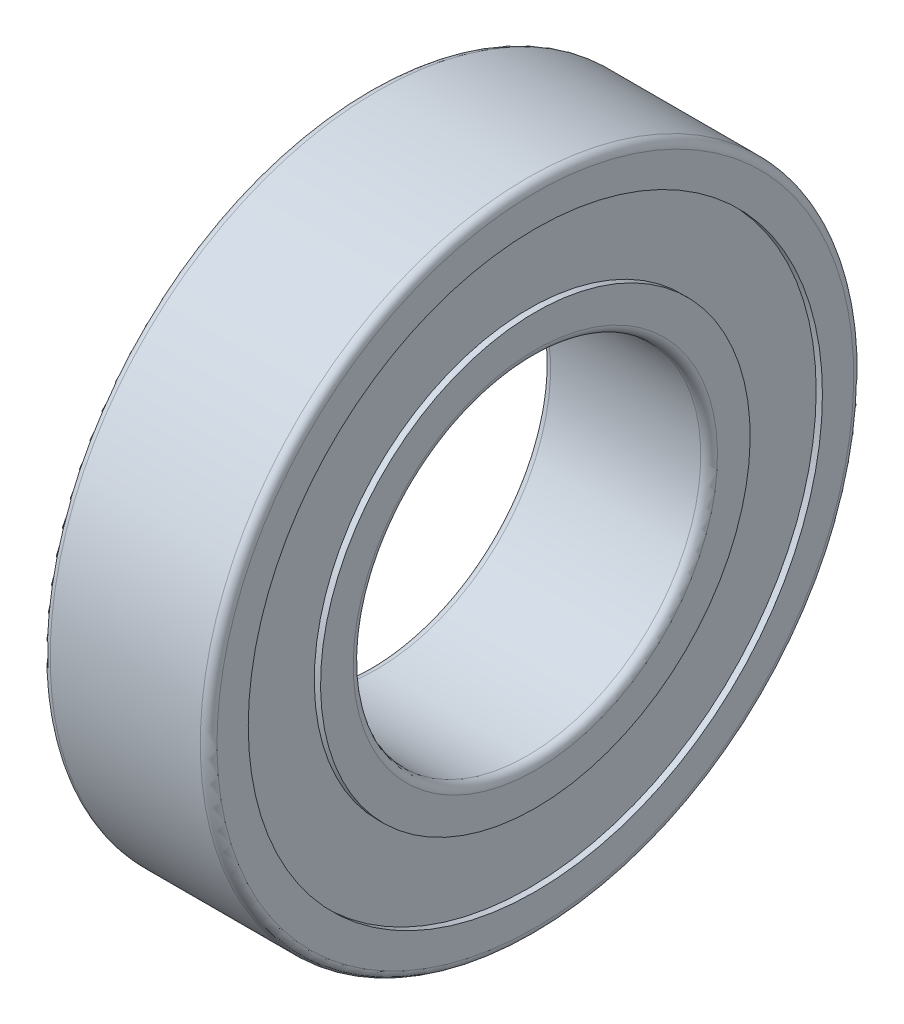
ISO-10303-21;
HEADER;
FILE_DESCRIPTION(('STEP AP214'),'2;1');
FILE_NAME('part.step','',(''),(''),'','','');
FILE_SCHEMA(('AUTOMOTIVE_DESIGN { 1 0 10303 214 1 1 1 1 }'));
ENDSEC;
DATA;
#1=APPLICATION_CONTEXT('core data for automotive mechanical design processes');
#2=APPLICATION_PROTOCOL_DEFINITION('international standard','automotive_design',2000,#1);
#3=PRODUCT_CONTEXT('',#1,'mechanical');
#4=PRODUCT('Part','Part','',(#3));
#5=PRODUCT_RELATED_PRODUCT_CATEGORY('part','',(#4));
#6=PRODUCT_DEFINITION_FORMATION('','',#4);
#7=PRODUCT_DEFINITION_CONTEXT('part definition',#1,'design');
#8=PRODUCT_DEFINITION('design','',#6,#7);
#9=PRODUCT_DEFINITION_SHAPE('','',#8);
#10=(LENGTH_UNIT() NAMED_UNIT(*) SI_UNIT(.MILLI.,.METRE.));
#11=(NAMED_UNIT(*) PLANE_ANGLE_UNIT() SI_UNIT($,.RADIAN.));
#12=(NAMED_UNIT(*) SI_UNIT($,.STERADIAN.) SOLID_ANGLE_UNIT());
#13=UNCERTAINTY_MEASURE_WITH_UNIT(LENGTH_MEASURE(1.E-05),#10,'distance_accuracy_value','');
#14=(GEOMETRIC_REPRESENTATION_CONTEXT(3) GLOBAL_UNCERTAINTY_ASSIGNED_CONTEXT((#13)) GLOBAL_UNIT_ASSIGNED_CONTEXT((#10,
#11,#12)) REPRESENTATION_CONTEXT('',''));
#15=CARTESIAN_POINT('',(0.,0.,0.));
#16=DIRECTION('',(0.,0.,1.));
#17=DIRECTION('',(1.,0.,0.));
#18=AXIS2_PLACEMENT_3D('',#15,#16,#17);
#19=CARTESIAN_POINT('',(0.,0.,0.));
#20=DIRECTION('',(-1.,0.,0.));
#21=DIRECTION('',(0.,-1.,0.));
#22=AXIS2_PLACEMENT_3D('',#19,#20,#21);
#23=CYLINDRICAL_SURFACE('',#22,12.5);
#24=CARTESIAN_POINT('',(0.6,0.,0.));
#25=DIRECTION('',(1.,0.,0.));
#26=DIRECTION('',(0.,1.,0.));
#27=AXIS2_PLACEMENT_3D('',#24,#25,#26);
#28=CIRCLE('',#27,12.5);
#29=CARTESIAN_POINT('',(0.6,12.5,0.));
#30=VERTEX_POINT('',#29);
#31=EDGE_CURVE('E59',#30,#30,#28,.F.);
#32=ORIENTED_EDGE('',*,*,#31,.T.);
#33=EDGE_LOOP('',(#32));
#34=FACE_BOUND('',#33,.T.);
#35=CARTESIAN_POINT('',(11.4,0.,0.));
#36=DIRECTION('',(-1.,0.,0.));
#37=DIRECTION('',(0.,-1.,0.));
#38=AXIS2_PLACEMENT_3D('',#35,#36,#37);
#39=CIRCLE('',#38,12.5);
#40=CARTESIAN_POINT('',(11.4,-12.5,0.));
#41=VERTEX_POINT('',#40);
#42=EDGE_CURVE('E62',#41,#41,#39,.F.);
#43=ORIENTED_EDGE('',*,*,#42,.T.);
#44=EDGE_LOOP('',(#43));
#45=FACE_BOUND('',#44,.T.);
#46=ADVANCED_FACE('F33',(#34,#45),#23,.F.);
#47=CARTESIAN_POINT('',(0.,12.5,0.));
#48=DIRECTION('',(1.,0.,0.));
#49=DIRECTION('',(0.,1.,0.));
#50=AXIS2_PLACEMENT_3D('',#47,#48,#49);
#51=PLANE('',#50);
#52=CARTESIAN_POINT('',(0.,0.,0.));
#53=DIRECTION('',(1.,0.,0.));
#54=DIRECTION('',(0.,1.,0.));
#55=AXIS2_PLACEMENT_3D('',#52,#53,#54);
#56=CIRCLE('',#55,13.1);
#57=CARTESIAN_POINT('',(0.,13.1,0.));
#58=VERTEX_POINT('',#57);
#59=EDGE_CURVE('E56',#58,#58,#56,.T.);
#60=ORIENTED_EDGE('',*,*,#59,.T.);
#61=EDGE_LOOP('',(#60));
#62=FACE_BOUND('',#61,.T.);
#63=CARTESIAN_POINT('',(0.,0.,0.));
#64=DIRECTION('',(-1.,0.,0.));
#65=DIRECTION('',(0.,-1.,0.));
#66=AXIS2_PLACEMENT_3D('',#63,#64,#65);
#67=CIRCLE('',#66,15.45);
#68=CARTESIAN_POINT('',(0.,-15.45,0.));
#69=VERTEX_POINT('',#68);
#70=EDGE_CURVE('E65',#69,#69,#67,.T.);
#71=ORIENTED_EDGE('',*,*,#70,.T.);
#72=EDGE_LOOP('',(#71));
#73=FACE_BOUND('',#72,.T.);
#74=ADVANCED_FACE('F108',(#62,#73),#51,.F.);
#75=CARTESIAN_POINT('',(0.,0.,0.));
#76=DIRECTION('',(-1.,0.,0.));
#77=DIRECTION('',(0.,-1.,0.));
#78=AXIS2_PLACEMENT_3D('',#75,#76,#77);
#79=CYLINDRICAL_SURFACE('',#78,15.45);
#80=ORIENTED_EDGE('',*,*,#70,.F.);
#81=EDGE_LOOP('',(#80));
#82=FACE_BOUND('',#81,.T.);
#83=CARTESIAN_POINT('',(0.45,0.,0.));
#84=DIRECTION('',(-1.,0.,0.));
#85=DIRECTION('',(0.,-1.,0.));
#86=AXIS2_PLACEMENT_3D('',#83,#84,#85);
#87=CIRCLE('',#86,15.45);
#88=CARTESIAN_POINT('',(0.449999999999999,-15.45,0.));
#89=VERTEX_POINT('',#88);
#90=EDGE_CURVE('E68',#89,#89,#87,.T.);
#91=ORIENTED_EDGE('',*,*,#90,.T.);
#92=EDGE_LOOP('',(#91));
#93=FACE_BOUND('',#92,.T.);
#94=ADVANCED_FACE('F114',(#82,#93),#79,.T.);
#95=CARTESIAN_POINT('',(0.45,15.45,0.));
#96=DIRECTION('',(1.,0.,0.));
#97=DIRECTION('',(0.,1.,0.));
#98=AXIS2_PLACEMENT_3D('',#95,#96,#97);
#99=PLANE('',#98);
#100=ORIENTED_EDGE('',*,*,#90,.F.);
#101=EDGE_LOOP('',(#100));
#102=FACE_BOUND('',#101,.T.);
#103=CARTESIAN_POINT('',(0.45,0.,0.));
#104=DIRECTION('',(-1.,0.,0.));
#105=DIRECTION('',(0.,-1.,0.));
#106=AXIS2_PLACEMENT_3D('',#103,#104,#105);
#107=CIRCLE('',#106,20.65);
#108=CARTESIAN_POINT('',(0.449999999999999,-20.65,0.));
#109=VERTEX_POINT('',#108);
#110=EDGE_CURVE('E71',#109,#109,#107,.T.);
#111=ORIENTED_EDGE('',*,*,#110,.T.);
#112=EDGE_LOOP('',(#111));
#113=FACE_BOUND('',#112,.T.);
#114=ADVANCED_FACE('F141',(#102,#113),#99,.F.);
#115=CARTESIAN_POINT('',(0.,0.,0.));
#116=DIRECTION('',(-1.,0.,0.));
#117=DIRECTION('',(0.,-1.,0.));
#118=AXIS2_PLACEMENT_3D('',#115,#116,#117);
#119=CYLINDRICAL_SURFACE('',#118,20.65);
#120=ORIENTED_EDGE('',*,*,#110,.F.);
#121=EDGE_LOOP('',(#120));
#122=FACE_BOUND('',#121,.T.);
#123=CARTESIAN_POINT('',(0.,0.,0.));
#124=DIRECTION('',(-1.,0.,0.));
#125=DIRECTION('',(0.,-1.,0.));
#126=AXIS2_PLACEMENT_3D('',#123,#124,#125);
#127=CIRCLE('',#126,20.65);
#128=CARTESIAN_POINT('',(0.,-20.65,0.));
#129=VERTEX_POINT('',#128);
#130=EDGE_CURVE('E74',#129,#129,#127,.T.);
#131=ORIENTED_EDGE('',*,*,#130,.T.);
#132=EDGE_LOOP('',(#131));
#133=FACE_BOUND('',#132,.T.);
#134=ADVANCED_FACE('F136',(#122,#133),#119,.F.);
#135=CARTESIAN_POINT('',(0.,20.65,0.));
#136=DIRECTION('',(1.,0.,0.));
#137=DIRECTION('',(0.,1.,0.));
#138=AXIS2_PLACEMENT_3D('',#135,#136,#137);
#139=PLANE('',#138);
#140=CARTESIAN_POINT('',(0.,0.,0.));
#141=DIRECTION('',(1.,0.,0.));
#142=DIRECTION('',(0.,1.,0.));
#143=AXIS2_PLACEMENT_3D('',#140,#141,#142);
#144=CIRCLE('',#143,22.9);
#145=CARTESIAN_POINT('',(0.,22.9,0.));
#146=VERTEX_POINT('',#145);
#147=EDGE_CURVE('E48',#146,#146,#144,.F.);
#148=ORIENTED_EDGE('',*,*,#147,.T.);
#149=EDGE_LOOP('',(#148));
#150=FACE_BOUND('',#149,.T.);
#151=ORIENTED_EDGE('',*,*,#130,.F.);
#152=EDGE_LOOP('',(#151));
#153=FACE_BOUND('',#152,.T.);
#154=ADVANCED_FACE('F132',(#150,#153),#139,.F.);
#155=CARTESIAN_POINT('',(0.,0.,0.));
#156=DIRECTION('',(-1.,0.,0.));
#157=DIRECTION('',(0.,-1.,0.));
#158=AXIS2_PLACEMENT_3D('',#155,#156,#157);
#159=CYLINDRICAL_SURFACE('',#158,23.5);
#160=CARTESIAN_POINT('',(0.599999999999999,0.,0.));
#161=DIRECTION('',(1.,0.,0.));
#162=DIRECTION('',(0.,1.,0.));
#163=AXIS2_PLACEMENT_3D('',#160,#161,#162);
#164=CIRCLE('',#163,23.5);
#165=CARTESIAN_POINT('',(0.6,23.5,0.));
#166=VERTEX_POINT('',#165);
#167=EDGE_CURVE('E40',#166,#166,#164,.T.);
#168=ORIENTED_EDGE('',*,*,#167,.T.);
#169=EDGE_LOOP('',(#168));
#170=FACE_BOUND('',#169,.T.);
#171=CARTESIAN_POINT('',(11.4,0.,0.));
#172=DIRECTION('',(-1.,0.,0.));
#173=DIRECTION('',(0.,-1.,0.));
#174=AXIS2_PLACEMENT_3D('',#171,#172,#173);
#175=CIRCLE('',#174,23.5);
#176=CARTESIAN_POINT('',(11.4,-23.5,0.));
#177=VERTEX_POINT('',#176);
#178=EDGE_CURVE('E44',#177,#177,#175,.T.);
#179=ORIENTED_EDGE('',*,*,#178,.T.);
#180=EDGE_LOOP('',(#179));
#181=FACE_BOUND('',#180,.T.);
#182=ADVANCED_FACE('F135',(#170,#181),#159,.T.);
#183=CARTESIAN_POINT('',(12.,23.5,0.));
#184=DIRECTION('',(-1.,0.,0.));
#185=DIRECTION('',(0.,-1.,0.));
#186=AXIS2_PLACEMENT_3D('',#183,#184,#185);
#187=PLANE('',#186);
#188=CARTESIAN_POINT('',(12.,0.,0.));
#189=DIRECTION('',(-1.,0.,0.));
#190=DIRECTION('',(0.,-1.,0.));
#191=AXIS2_PLACEMENT_3D('',#188,#189,#190);
#192=CIRCLE('',#191,22.9);
#193=CARTESIAN_POINT('',(12.,-22.9,0.));
#194=VERTEX_POINT('',#193);
#195=EDGE_CURVE('E10',#194,#194,#192,.F.);
#196=ORIENTED_EDGE('',*,*,#195,.T.);
#197=EDGE_LOOP('',(#196));
#198=FACE_BOUND('',#197,.T.);
#199=CARTESIAN_POINT('',(12.,0.,0.));
#200=DIRECTION('',(-1.,0.,0.));
#201=DIRECTION('',(0.,-1.,0.));
#202=AXIS2_PLACEMENT_3D('',#199,#200,#201);
#203=CIRCLE('',#202,20.65);
#204=CARTESIAN_POINT('',(12.,-20.65,0.));
#205=VERTEX_POINT('',#204);
#206=EDGE_CURVE('E77',#205,#205,#203,.T.);
#207=ORIENTED_EDGE('',*,*,#206,.T.);
#208=EDGE_LOOP('',(#207));
#209=FACE_BOUND('',#208,.T.);
#210=ADVANCED_FACE('F181',(#198,#209),#187,.F.);
#211=CARTESIAN_POINT('',(0.,0.,0.));
#212=DIRECTION('',(-1.,0.,0.));
#213=DIRECTION('',(0.,-1.,0.));
#214=AXIS2_PLACEMENT_3D('',#211,#212,#213);
#215=CYLINDRICAL_SURFACE('',#214,20.65);
#216=ORIENTED_EDGE('',*,*,#206,.F.);
#217=EDGE_LOOP('',(#216));
#218=FACE_BOUND('',#217,.T.);
#219=CARTESIAN_POINT('',(11.55,0.,0.));
#220=DIRECTION('',(-1.,0.,0.));
#221=DIRECTION('',(0.,-1.,0.));
#222=AXIS2_PLACEMENT_3D('',#219,#220,#221);
#223=CIRCLE('',#222,20.65);
#224=CARTESIAN_POINT('',(11.55,-20.65,0.));
#225=VERTEX_POINT('',#224);
#226=EDGE_CURVE('E80',#225,#225,#223,.T.);
#227=ORIENTED_EDGE('',*,*,#226,.T.);
#228=EDGE_LOOP('',(#227));
#229=FACE_BOUND('',#228,.T.);
#230=ADVANCED_FACE('F176',(#218,#229),#215,.F.);
#231=CARTESIAN_POINT('',(11.55,20.65,0.));
#232=DIRECTION('',(-1.,0.,0.));
#233=DIRECTION('',(0.,-1.,0.));
#234=AXIS2_PLACEMENT_3D('',#231,#232,#233);
#235=PLANE('',#234);
#236=ORIENTED_EDGE('',*,*,#226,.F.);
#237=EDGE_LOOP('',(#236));
#238=FACE_BOUND('',#237,.T.);
#239=CARTESIAN_POINT('',(11.55,0.,0.));
#240=DIRECTION('',(-1.,0.,0.));
#241=DIRECTION('',(0.,-1.,0.));
#242=AXIS2_PLACEMENT_3D('',#239,#240,#241);
#243=CIRCLE('',#242,15.45);
#244=CARTESIAN_POINT('',(11.55,-15.45,0.));
#245=VERTEX_POINT('',#244);
#246=EDGE_CURVE('E83',#245,#245,#243,.T.);
#247=ORIENTED_EDGE('',*,*,#246,.T.);
#248=EDGE_LOOP('',(#247));
#249=FACE_BOUND('',#248,.T.);
#250=ADVANCED_FACE('F104',(#238,#249),#235,.F.);
#251=CARTESIAN_POINT('',(0.,0.,0.));
#252=DIRECTION('',(-1.,0.,0.));
#253=DIRECTION('',(0.,-1.,0.));
#254=AXIS2_PLACEMENT_3D('',#251,#252,#253);
#255=CYLINDRICAL_SURFACE('',#254,15.45);
#256=ORIENTED_EDGE('',*,*,#246,.F.);
#257=EDGE_LOOP('',(#256));
#258=FACE_BOUND('',#257,.T.);
#259=CARTESIAN_POINT('',(12.,0.,0.));
#260=DIRECTION('',(-1.,0.,0.));
#261=DIRECTION('',(0.,-1.,0.));
#262=AXIS2_PLACEMENT_3D('',#259,#260,#261);
#263=CIRCLE('',#262,15.45);
#264=CARTESIAN_POINT('',(12.,-15.45,0.));
#265=VERTEX_POINT('',#264);
#266=EDGE_CURVE('E86',#265,#265,#263,.T.);
#267=ORIENTED_EDGE('',*,*,#266,.T.);
#268=EDGE_LOOP('',(#267));
#269=FACE_BOUND('',#268,.T.);
#270=ADVANCED_FACE('F90',(#258,#269),#255,.T.);
#271=CARTESIAN_POINT('',(12.,15.45,0.));
#272=DIRECTION('',(-1.,0.,0.));
#273=DIRECTION('',(0.,-1.,0.));
#274=AXIS2_PLACEMENT_3D('',#271,#272,#273);
#275=PLANE('',#274);
#276=CARTESIAN_POINT('',(12.,0.,0.));
#277=DIRECTION('',(-1.,0.,0.));
#278=DIRECTION('',(0.,-1.,0.));
#279=AXIS2_PLACEMENT_3D('',#276,#277,#278);
#280=CIRCLE('',#279,13.1);
#281=CARTESIAN_POINT('',(12.,-13.1,0.));
#282=VERTEX_POINT('',#281);
#283=EDGE_CURVE('E53',#282,#282,#280,.T.);
#284=ORIENTED_EDGE('',*,*,#283,.T.);
#285=EDGE_LOOP('',(#284));
#286=FACE_BOUND('',#285,.T.);
#287=ORIENTED_EDGE('',*,*,#266,.F.);
#288=EDGE_LOOP('',(#287));
#289=FACE_BOUND('',#288,.T.);
#290=ADVANCED_FACE('F92',(#286,#289),#275,.F.);
#291=CARTESIAN_POINT('',(0.6,0.,0.));
#292=DIRECTION('',(1.,0.,0.));
#293=DIRECTION('',(0.,1.,0.));
#294=AXIS2_PLACEMENT_3D('',#291,#292,#293);
#295=TOROIDAL_SURFACE('',#294,13.1,0.6);
#296=ORIENTED_EDGE('',*,*,#59,.F.);
#297=EDGE_LOOP('',(#296));
#298=FACE_BOUND('',#297,.T.);
#299=ORIENTED_EDGE('',*,*,#31,.F.);
#300=EDGE_LOOP('',(#299));
#301=FACE_BOUND('',#300,.T.);
#302=ADVANCED_FACE('F94',(#298,#301),#295,.T.);
#303=CARTESIAN_POINT('',(11.4,0.,0.));
#304=DIRECTION('',(-1.,0.,0.));
#305=DIRECTION('',(0.,-1.,0.));
#306=AXIS2_PLACEMENT_3D('',#303,#304,#305);
#307=TOROIDAL_SURFACE('',#306,13.1,0.6);
#308=ORIENTED_EDGE('',*,*,#42,.F.);
#309=EDGE_LOOP('',(#308));
#310=FACE_BOUND('',#309,.T.);
#311=ORIENTED_EDGE('',*,*,#283,.F.);
#312=EDGE_LOOP('',(#311));
#313=FACE_BOUND('',#312,.T.);
#314=ADVANCED_FACE('F101',(#310,#313),#307,.T.);
#315=CARTESIAN_POINT('',(0.599999999999999,0.,0.));
#316=DIRECTION('',(1.,0.,0.));
#317=DIRECTION('',(0.,1.,0.));
#318=AXIS2_PLACEMENT_3D('',#315,#316,#317);
#319=TOROIDAL_SURFACE('',#318,22.9,0.6);
#320=ORIENTED_EDGE('',*,*,#167,.F.);
#321=EDGE_LOOP('',(#320));
#322=FACE_BOUND('',#321,.T.);
#323=ORIENTED_EDGE('',*,*,#147,.F.);
#324=EDGE_LOOP('',(#323));
#325=FACE_BOUND('',#324,.T.);
#326=ADVANCED_FACE('F121',(#322,#325),#319,.T.);
#327=CARTESIAN_POINT('',(11.4,0.,0.));
#328=DIRECTION('',(-1.,0.,0.));
#329=DIRECTION('',(0.,-1.,0.));
#330=AXIS2_PLACEMENT_3D('',#327,#328,#329);
#331=TOROIDAL_SURFACE('',#330,22.9,0.6);
#332=ORIENTED_EDGE('',*,*,#195,.F.);
#333=EDGE_LOOP('',(#332));
#334=FACE_BOUND('',#333,.T.);
#335=ORIENTED_EDGE('',*,*,#178,.F.);
#336=EDGE_LOOP('',(#335));
#337=FACE_BOUND('',#336,.T.);
#338=ADVANCED_FACE('F35',(#334,#337),#331,.T.);
#339=CLOSED_SHELL('',(#46,#74,#94,#114,#134,#154,#182,#210,#230,#250,#270,#290,#302,#314,#326,#338));
#340=MANIFOLD_SOLID_BREP('B2',#339);
#341=ADVANCED_BREP_SHAPE_REPRESENTATION('',(#18,#340),#14);
#342=SHAPE_DEFINITION_REPRESENTATION(#9,#341);
ENDSEC;
END-ISO-10303-21;
